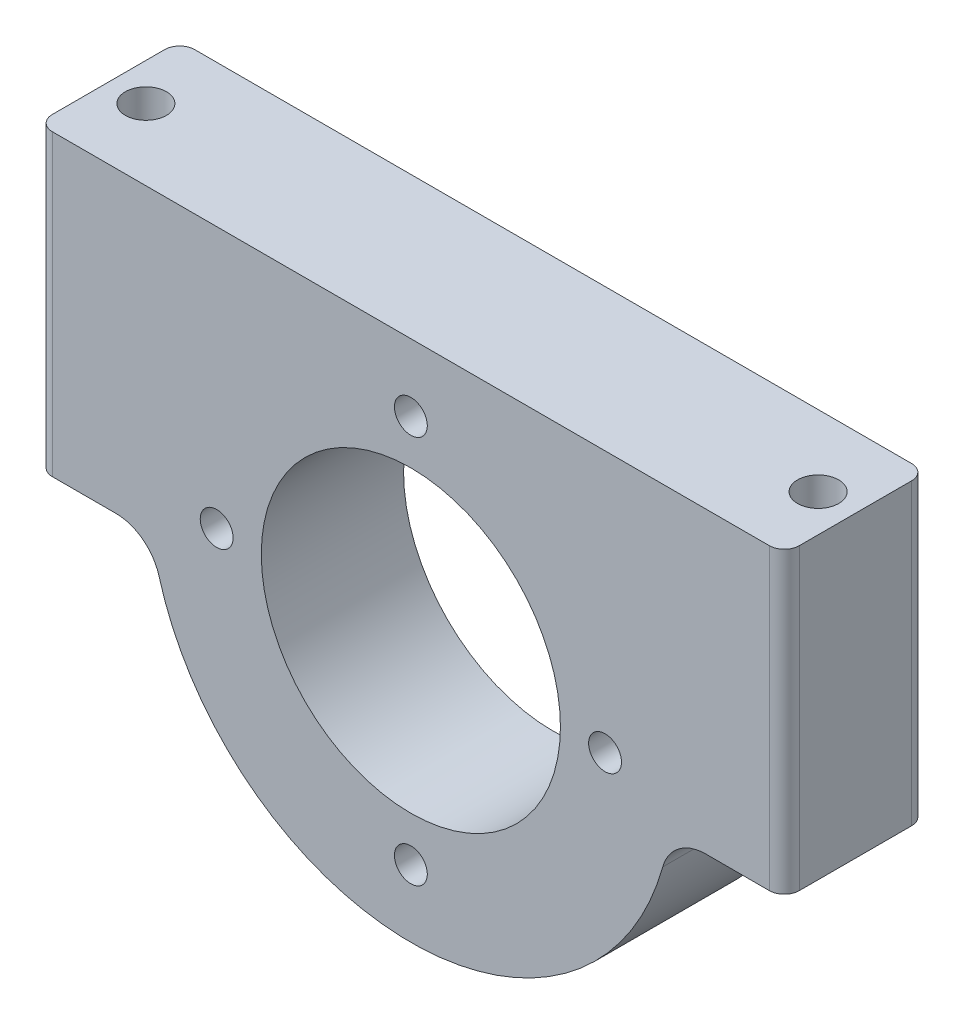
ISO-10303-21;
HEADER;
FILE_DESCRIPTION(('STEP AP214'),'2;1');
FILE_NAME('part.step','',(''),(''),'','','');
FILE_SCHEMA(('AUTOMOTIVE_DESIGN { 1 0 10303 214 1 1 1 1 }'));
ENDSEC;
DATA;
#1=APPLICATION_CONTEXT('core data for automotive mechanical design processes');
#2=APPLICATION_PROTOCOL_DEFINITION('international standard','automotive_design',2000,#1);
#3=PRODUCT_CONTEXT('',#1,'mechanical');
#4=PRODUCT('Part','Part','',(#3));
#5=PRODUCT_RELATED_PRODUCT_CATEGORY('part','',(#4));
#6=PRODUCT_DEFINITION_FORMATION('','',#4);
#7=PRODUCT_DEFINITION_CONTEXT('part definition',#1,'design');
#8=PRODUCT_DEFINITION('design','',#6,#7);
#9=PRODUCT_DEFINITION_SHAPE('','',#8);
#10=(LENGTH_UNIT() NAMED_UNIT(*) SI_UNIT(.MILLI.,.METRE.));
#11=(NAMED_UNIT(*) PLANE_ANGLE_UNIT() SI_UNIT($,.RADIAN.));
#12=(NAMED_UNIT(*) SI_UNIT($,.STERADIAN.) SOLID_ANGLE_UNIT());
#13=UNCERTAINTY_MEASURE_WITH_UNIT(LENGTH_MEASURE(1.E-05),#10,'distance_accuracy_value','');
#14=(GEOMETRIC_REPRESENTATION_CONTEXT(3) GLOBAL_UNCERTAINTY_ASSIGNED_CONTEXT((#13)) GLOBAL_UNIT_ASSIGNED_CONTEXT((#10,
#11,#12)) REPRESENTATION_CONTEXT('',''));
#15=CARTESIAN_POINT('',(0.,0.,0.));
#16=DIRECTION('',(0.,0.,1.));
#17=DIRECTION('',(1.,0.,0.));
#18=AXIS2_PLACEMENT_3D('',#15,#16,#17);
#19=CARTESIAN_POINT('',(463.810652388512,-202.071051768843,-19.05));
#20=DIRECTION('',(0.,0.,-1.));
#21=DIRECTION('',(-1.,0.,0.));
#22=AXIS2_PLACEMENT_3D('',#19,#20,#21);
#23=CYLINDRICAL_SURFACE('',#22,4.125);
#24=CARTESIAN_POINT('',(463.810652388512,-202.071051768843,-19.05));
#25=DIRECTION('',(0.,0.,-1.));
#26=DIRECTION('',(-1.,0.,0.));
#27=AXIS2_PLACEMENT_3D('',#24,#25,#26);
#28=CIRCLE('',#27,4.125);
#29=CARTESIAN_POINT('',(459.685652388512,-202.071051768843,-19.05));
#30=VERTEX_POINT('',#29);
#31=EDGE_CURVE('E160',#30,#30,#28,.F.);
#32=ORIENTED_EDGE('',*,*,#31,.F.);
#33=EDGE_LOOP('',(#32));
#34=FACE_BOUND('',#33,.T.);
#35=CARTESIAN_POINT('',(463.810652388512,-202.071051768843,-15.05));
#36=DIRECTION('',(0.,0.,-1.));
#37=DIRECTION('',(-1.,0.,0.));
#38=AXIS2_PLACEMENT_3D('',#35,#36,#37);
#39=CIRCLE('',#38,4.125);
#40=CARTESIAN_POINT('',(459.685652388512,-202.071051768843,-15.05));
#41=VERTEX_POINT('',#40);
#42=EDGE_CURVE('E20',#41,#41,#39,.T.);
#43=ORIENTED_EDGE('',*,*,#42,.F.);
#44=EDGE_LOOP('',(#43));
#45=FACE_BOUND('',#44,.T.);
#46=ADVANCED_FACE('F17',(#34,#45),#23,.F.);
#47=CARTESIAN_POINT('',(463.810652388512,-254.071051768843,-19.05));
#48=DIRECTION('',(0.,0.,-1.));
#49=DIRECTION('',(-1.,0.,0.));
#50=AXIS2_PLACEMENT_3D('',#47,#48,#49);
#51=CYLINDRICAL_SURFACE('',#50,4.125);
#52=CARTESIAN_POINT('',(463.810652388512,-254.071051768843,-19.05));
#53=DIRECTION('',(0.,0.,-1.));
#54=DIRECTION('',(-1.,0.,0.));
#55=AXIS2_PLACEMENT_3D('',#52,#53,#54);
#56=CIRCLE('',#55,4.125);
#57=CARTESIAN_POINT('',(459.685652388512,-254.071051768843,-19.05));
#58=VERTEX_POINT('',#57);
#59=EDGE_CURVE('E271',#58,#58,#56,.F.);
#60=ORIENTED_EDGE('',*,*,#59,.F.);
#61=EDGE_LOOP('',(#60));
#62=FACE_BOUND('',#61,.T.);
#63=CARTESIAN_POINT('',(463.810652388512,-254.071051768843,-15.05));
#64=DIRECTION('',(0.,0.,-1.));
#65=DIRECTION('',(-1.,0.,0.));
#66=AXIS2_PLACEMENT_3D('',#63,#64,#65);
#67=CIRCLE('',#66,4.125);
#68=CARTESIAN_POINT('',(459.685652388512,-254.071051768843,-15.05));
#69=VERTEX_POINT('',#68);
#70=EDGE_CURVE('E284',#69,#69,#67,.T.);
#71=ORIENTED_EDGE('',*,*,#70,.F.);
#72=EDGE_LOOP('',(#71));
#73=FACE_BOUND('',#72,.T.);
#74=ADVANCED_FACE('F297',(#62,#73),#51,.F.);
#75=CARTESIAN_POINT('',(489.810652388512,-228.071051768843,-19.05));
#76=DIRECTION('',(0.,0.,-1.));
#77=DIRECTION('',(-1.,0.,0.));
#78=AXIS2_PLACEMENT_3D('',#75,#76,#77);
#79=CYLINDRICAL_SURFACE('',#78,4.125);
#80=CARTESIAN_POINT('',(489.810652388512,-228.071051768843,-19.05));
#81=DIRECTION('',(0.,0.,-1.));
#82=DIRECTION('',(-1.,0.,0.));
#83=AXIS2_PLACEMENT_3D('',#80,#81,#82);
#84=CIRCLE('',#83,4.125);
#85=CARTESIAN_POINT('',(485.685652388512,-228.071051768843,-19.05));
#86=VERTEX_POINT('',#85);
#87=EDGE_CURVE('E267',#86,#86,#84,.F.);
#88=ORIENTED_EDGE('',*,*,#87,.F.);
#89=EDGE_LOOP('',(#88));
#90=FACE_BOUND('',#89,.T.);
#91=CARTESIAN_POINT('',(489.810652388512,-228.071051768843,-15.05));
#92=DIRECTION('',(0.,0.,-1.));
#93=DIRECTION('',(-1.,0.,0.));
#94=AXIS2_PLACEMENT_3D('',#91,#92,#93);
#95=CIRCLE('',#94,4.125);
#96=CARTESIAN_POINT('',(485.685652388512,-228.071051768843,-15.05));
#97=VERTEX_POINT('',#96);
#98=EDGE_CURVE('E281',#97,#97,#95,.T.);
#99=ORIENTED_EDGE('',*,*,#98,.F.);
#100=EDGE_LOOP('',(#99));
#101=FACE_BOUND('',#100,.T.);
#102=ADVANCED_FACE('F302',(#90,#101),#79,.F.);
#103=CARTESIAN_POINT('',(437.810652388512,-228.071051768843,-19.05));
#104=DIRECTION('',(0.,0.,-1.));
#105=DIRECTION('',(-1.,0.,0.));
#106=AXIS2_PLACEMENT_3D('',#103,#104,#105);
#107=CYLINDRICAL_SURFACE('',#106,4.125);
#108=CARTESIAN_POINT('',(437.810652388512,-228.071051768843,-19.05));
#109=DIRECTION('',(0.,0.,-1.));
#110=DIRECTION('',(-1.,0.,0.));
#111=AXIS2_PLACEMENT_3D('',#108,#109,#110);
#112=CIRCLE('',#111,4.125);
#113=CARTESIAN_POINT('',(433.685652388512,-228.071051768843,-19.05));
#114=VERTEX_POINT('',#113);
#115=EDGE_CURVE('E125',#114,#114,#112,.F.);
#116=ORIENTED_EDGE('',*,*,#115,.F.);
#117=EDGE_LOOP('',(#116));
#118=FACE_BOUND('',#117,.T.);
#119=CARTESIAN_POINT('',(437.810652388512,-228.071051768843,-15.05));
#120=DIRECTION('',(0.,0.,-1.));
#121=DIRECTION('',(-1.,0.,0.));
#122=AXIS2_PLACEMENT_3D('',#119,#120,#121);
#123=CIRCLE('',#122,4.125);
#124=CARTESIAN_POINT('',(433.685652388512,-228.071051768843,-15.05));
#125=VERTEX_POINT('',#124);
#126=EDGE_CURVE('E161',#125,#125,#123,.T.);
#127=ORIENTED_EDGE('',*,*,#126,.F.);
#128=EDGE_LOOP('',(#127));
#129=FACE_BOUND('',#128,.T.);
#130=ADVANCED_FACE('F399',(#118,#129),#107,.F.);
#131=CARTESIAN_POINT('',(5.,0.78094512195122,-15.05));
#132=DIRECTION('',(0.,0.,-1.));
#133=DIRECTION('',(-1.,0.,0.));
#134=AXIS2_PLACEMENT_3D('',#131,#132,#133);
#135=PLANE('',#134);
#136=CARTESIAN_POINT('',(463.810652388512,-202.071051768843,-15.05));
#137=DIRECTION('',(0.,0.,-1.));
#138=DIRECTION('',(-1.,0.,0.));
#139=AXIS2_PLACEMENT_3D('',#136,#137,#138);
#140=CIRCLE('',#139,2.2);
#141=CARTESIAN_POINT('',(461.610652388512,-202.071051768843,-15.05));
#142=VERTEX_POINT('',#141);
#143=EDGE_CURVE('E154',#142,#142,#140,.F.);
#144=ORIENTED_EDGE('',*,*,#143,.T.);
#145=EDGE_LOOP('',(#144));
#146=FACE_BOUND('',#145,.T.);
#147=ORIENTED_EDGE('',*,*,#42,.T.);
#148=EDGE_LOOP('',(#147));
#149=FACE_BOUND('',#148,.T.);
#150=ADVANCED_FACE('F294',(#146,#149),#135,.T.);
#151=CARTESIAN_POINT('',(5.,0.78094512195122,-15.05));
#152=DIRECTION('',(0.,0.,-1.));
#153=DIRECTION('',(-1.,0.,0.));
#154=AXIS2_PLACEMENT_3D('',#151,#152,#153);
#155=PLANE('',#154);
#156=CARTESIAN_POINT('',(463.810652388512,-254.071051768843,-15.05));
#157=DIRECTION('',(0.,0.,-1.));
#158=DIRECTION('',(-1.,0.,0.));
#159=AXIS2_PLACEMENT_3D('',#156,#157,#158);
#160=CIRCLE('',#159,2.2);
#161=CARTESIAN_POINT('',(461.610652388512,-254.071051768843,-15.05));
#162=VERTEX_POINT('',#161);
#163=EDGE_CURVE('E257',#162,#162,#160,.F.);
#164=ORIENTED_EDGE('',*,*,#163,.T.);
#165=EDGE_LOOP('',(#164));
#166=FACE_BOUND('',#165,.T.);
#167=ORIENTED_EDGE('',*,*,#70,.T.);
#168=EDGE_LOOP('',(#167));
#169=FACE_BOUND('',#168,.T.);
#170=ADVANCED_FACE('F392',(#166,#169),#155,.T.);
#171=CARTESIAN_POINT('',(5.,0.78094512195122,-15.05));
#172=DIRECTION('',(0.,0.,-1.));
#173=DIRECTION('',(-1.,0.,0.));
#174=AXIS2_PLACEMENT_3D('',#171,#172,#173);
#175=PLANE('',#174);
#176=CARTESIAN_POINT('',(489.810652388512,-228.071051768843,-15.05));
#177=DIRECTION('',(0.,0.,-1.));
#178=DIRECTION('',(-1.,0.,0.));
#179=AXIS2_PLACEMENT_3D('',#176,#177,#178);
#180=CIRCLE('',#179,2.2);
#181=CARTESIAN_POINT('',(487.610652388512,-228.071051768843,-15.05));
#182=VERTEX_POINT('',#181);
#183=EDGE_CURVE('E249',#182,#182,#180,.F.);
#184=ORIENTED_EDGE('',*,*,#183,.T.);
#185=EDGE_LOOP('',(#184));
#186=FACE_BOUND('',#185,.T.);
#187=ORIENTED_EDGE('',*,*,#98,.T.);
#188=EDGE_LOOP('',(#187));
#189=FACE_BOUND('',#188,.T.);
#190=ADVANCED_FACE('F388',(#186,#189),#175,.T.);
#191=CARTESIAN_POINT('',(5.,0.78094512195122,-15.05));
#192=DIRECTION('',(0.,0.,-1.));
#193=DIRECTION('',(-1.,0.,0.));
#194=AXIS2_PLACEMENT_3D('',#191,#192,#193);
#195=PLANE('',#194);
#196=CARTESIAN_POINT('',(437.810652388512,-228.071051768843,-15.05));
#197=DIRECTION('',(0.,0.,-1.));
#198=DIRECTION('',(-1.,0.,0.));
#199=AXIS2_PLACEMENT_3D('',#196,#197,#198);
#200=CIRCLE('',#199,2.2);
#201=CARTESIAN_POINT('',(435.610652388512,-228.071051768843,-15.05));
#202=VERTEX_POINT('',#201);
#203=EDGE_CURVE('E245',#202,#202,#200,.F.);
#204=ORIENTED_EDGE('',*,*,#203,.T.);
#205=EDGE_LOOP('',(#204));
#206=FACE_BOUND('',#205,.T.);
#207=ORIENTED_EDGE('',*,*,#126,.T.);
#208=EDGE_LOOP('',(#207));
#209=FACE_BOUND('',#208,.T.);
#210=ADVANCED_FACE('F384',(#206,#209),#195,.T.);
#211=CARTESIAN_POINT('',(508.810652388512,-186.071049368843,-9.52500000000001));
#212=DIRECTION('',(0.,-1.,0.));
#213=DIRECTION('',(0.,0.,-1.));
#214=AXIS2_PLACEMENT_3D('',#211,#212,#213);
#215=CYLINDRICAL_SURFACE('',#214,2.75);
#216=CARTESIAN_POINT('',(508.810652388512,-233.071051768843,-9.52500000000001));
#217=DIRECTION('',(0.,-1.,0.));
#218=DIRECTION('',(0.,0.,-1.));
#219=AXIS2_PLACEMENT_3D('',#216,#217,#218);
#220=CIRCLE('',#219,2.75);
#221=CARTESIAN_POINT('',(508.810652388512,-233.071051768843,-12.275));
#222=VERTEX_POINT('',#221);
#223=EDGE_CURVE('E232',#222,#222,#220,.F.);
#224=ORIENTED_EDGE('',*,*,#223,.F.);
#225=EDGE_LOOP('',(#224));
#226=FACE_BOUND('',#225,.T.);
#227=CARTESIAN_POINT('',(508.810652388512,-193.071051768843,-9.52500000000001));
#228=DIRECTION('',(0.,-1.,0.));
#229=DIRECTION('',(0.,0.,-1.));
#230=AXIS2_PLACEMENT_3D('',#227,#228,#229);
#231=CIRCLE('',#230,2.75);
#232=CARTESIAN_POINT('',(508.810652388512,-193.071051768843,-12.275));
#233=VERTEX_POINT('',#232);
#234=EDGE_CURVE('E241',#233,#233,#231,.T.);
#235=ORIENTED_EDGE('',*,*,#234,.F.);
#236=EDGE_LOOP('',(#235));
#237=FACE_BOUND('',#236,.T.);
#238=ADVANCED_FACE('F381',(#226,#237),#215,.F.);
#239=CARTESIAN_POINT('',(511.810652388512,0.78094512195122,-17.05));
#240=DIRECTION('',(0.,-1.,0.));
#241=DIRECTION('',(0.,0.,-1.));
#242=AXIS2_PLACEMENT_3D('',#239,#240,#241);
#243=CYLINDRICAL_SURFACE('',#242,2.);
#244=DIRECTION('',(0.,1.,0.));
#245=VECTOR('',#244,1.);
#246=CARTESIAN_POINT('',(513.810652388512,-263.071051768843,-17.05));
#247=LINE('',#246,#245);
#248=CARTESIAN_POINT('',(513.810652388512,-233.071051768843,-17.05));
#249=VERTEX_POINT('',#248);
#250=CARTESIAN_POINT('',(513.810652388512,-193.071051768843,-17.05));
#251=VERTEX_POINT('',#250);
#252=EDGE_CURVE('E98',#249,#251,#247,.T.);
#253=ORIENTED_EDGE('',*,*,#252,.F.);
#254=CARTESIAN_POINT('',(511.810652388512,-233.071051768843,-17.05));
#255=DIRECTION('',(0.,-1.,0.));
#256=DIRECTION('',(0.,0.,-1.));
#257=AXIS2_PLACEMENT_3D('',#254,#255,#256);
#258=CIRCLE('',#257,2.);
#259=CARTESIAN_POINT('',(511.810652388512,-233.071051768843,-19.05));
#260=VERTEX_POINT('',#259);
#261=EDGE_CURVE('E119',#260,#249,#258,.T.);
#262=ORIENTED_EDGE('',*,*,#261,.F.);
#263=DIRECTION('',(0.,1.,0.));
#264=VECTOR('',#263,1.);
#265=CARTESIAN_POINT('',(511.810652388512,0.78094512195122,-19.05));
#266=LINE('',#265,#264);
#267=CARTESIAN_POINT('',(511.810652388512,-193.071051768843,-19.05));
#268=VERTEX_POINT('',#267);
#269=EDGE_CURVE('E117',#268,#260,#266,.F.);
#270=ORIENTED_EDGE('',*,*,#269,.F.);
#271=CARTESIAN_POINT('',(511.810652388512,-193.071051768843,-17.05));
#272=DIRECTION('',(0.,-1.,0.));
#273=DIRECTION('',(0.,0.,-1.));
#274=AXIS2_PLACEMENT_3D('',#271,#272,#273);
#275=CIRCLE('',#274,2.);
#276=EDGE_CURVE('E104',#251,#268,#275,.F.);
#277=ORIENTED_EDGE('',*,*,#276,.F.);
#278=EDGE_LOOP('',(#253,#262,#270,#277));
#279=FACE_BOUND('',#278,.T.);
#280=ADVANCED_FACE('F118',(#279),#243,.T.);
#281=CARTESIAN_POINT('',(513.810652388512,-263.071051768843,0.));
#282=DIRECTION('',(1.,0.,0.));
#283=DIRECTION('',(0.,0.,-1.));
#284=AXIS2_PLACEMENT_3D('',#281,#282,#283);
#285=PLANE('',#284);
#286=ORIENTED_EDGE('',*,*,#252,.T.);
#287=DIRECTION('',(0.,0.,1.));
#288=VECTOR('',#287,1.);
#289=CARTESIAN_POINT('',(513.810652388512,-193.071051768843,0.));
#290=LINE('',#289,#288);
#291=CARTESIAN_POINT('',(513.810652388512,-193.071051768843,-2.));
#292=VERTEX_POINT('',#291);
#293=EDGE_CURVE('E112',#292,#251,#290,.F.);
#294=ORIENTED_EDGE('',*,*,#293,.F.);
#295=DIRECTION('',(0.,-1.,0.));
#296=VECTOR('',#295,1.);
#297=CARTESIAN_POINT('',(513.810652388512,0.78094512195122,-2.));
#298=LINE('',#297,#296);
#299=CARTESIAN_POINT('',(513.810652388512,-233.071051768843,-2.));
#300=VERTEX_POINT('',#299);
#301=EDGE_CURVE('E155',#300,#292,#298,.F.);
#302=ORIENTED_EDGE('',*,*,#301,.F.);
#303=DIRECTION('',(0.,0.,-1.));
#304=VECTOR('',#303,1.);
#305=CARTESIAN_POINT('',(513.810652388512,-233.071051768843,-9.52499999999998));
#306=LINE('',#305,#304);
#307=EDGE_CURVE('E228',#249,#300,#306,.F.);
#308=ORIENTED_EDGE('',*,*,#307,.F.);
#309=EDGE_LOOP('',(#286,#294,#302,#308));
#310=FACE_BOUND('',#309,.T.);
#311=ADVANCED_FACE('F375',(#310),#285,.T.);
#312=CARTESIAN_POINT('',(418.810652388512,-186.071049368843,-9.52500000000001));
#313=DIRECTION('',(0.,-1.,0.));
#314=DIRECTION('',(0.,0.,-1.));
#315=AXIS2_PLACEMENT_3D('',#312,#313,#314);
#316=CYLINDRICAL_SURFACE('',#315,2.75);
#317=CARTESIAN_POINT('',(418.810652388512,-233.071051768843,-9.52500000000001));
#318=DIRECTION('',(0.,-1.,0.));
#319=DIRECTION('',(0.,0.,-1.));
#320=AXIS2_PLACEMENT_3D('',#317,#318,#319);
#321=CIRCLE('',#320,2.75);
#322=CARTESIAN_POINT('',(418.810652388512,-233.071051768843,-12.275));
#323=VERTEX_POINT('',#322);
#324=EDGE_CURVE('E207',#323,#323,#321,.F.);
#325=ORIENTED_EDGE('',*,*,#324,.F.);
#326=EDGE_LOOP('',(#325));
#327=FACE_BOUND('',#326,.T.);
#328=CARTESIAN_POINT('',(418.810652388512,-193.071051768843,-9.52500000000001));
#329=DIRECTION('',(0.,-1.,0.));
#330=DIRECTION('',(0.,0.,-1.));
#331=AXIS2_PLACEMENT_3D('',#328,#329,#330);
#332=CIRCLE('',#331,2.75);
#333=CARTESIAN_POINT('',(418.810652388512,-193.071051768843,-12.275));
#334=VERTEX_POINT('',#333);
#335=EDGE_CURVE('E145',#334,#334,#332,.T.);
#336=ORIENTED_EDGE('',*,*,#335,.F.);
#337=EDGE_LOOP('',(#336));
#338=FACE_BOUND('',#337,.T.);
#339=ADVANCED_FACE('F371',(#327,#338),#316,.F.);
#340=CARTESIAN_POINT('',(415.810652388512,0.78094512195122,-17.05));
#341=DIRECTION('',(0.,1.,0.));
#342=DIRECTION('',(0.,0.,1.));
#343=AXIS2_PLACEMENT_3D('',#340,#341,#342);
#344=CYLINDRICAL_SURFACE('',#343,2.);
#345=DIRECTION('',(0.,1.,0.));
#346=VECTOR('',#345,1.);
#347=CARTESIAN_POINT('',(413.810652388512,-193.071051768843,-17.05));
#348=LINE('',#347,#346);
#349=CARTESIAN_POINT('',(413.810652388512,-193.071051768843,-17.05));
#350=VERTEX_POINT('',#349);
#351=CARTESIAN_POINT('',(413.810652388512,-233.071051768843,-17.05));
#352=VERTEX_POINT('',#351);
#353=EDGE_CURVE('E151',#350,#352,#348,.F.);
#354=ORIENTED_EDGE('',*,*,#353,.F.);
#355=CARTESIAN_POINT('',(415.810652388512,-193.071051768843,-17.05));
#356=DIRECTION('',(0.,1.,0.));
#357=DIRECTION('',(0.,0.,1.));
#358=AXIS2_PLACEMENT_3D('',#355,#356,#357);
#359=CIRCLE('',#358,2.);
#360=CARTESIAN_POINT('',(415.810652388512,-193.071051768843,-19.05));
#361=VERTEX_POINT('',#360);
#362=EDGE_CURVE('E132',#361,#350,#359,.T.);
#363=ORIENTED_EDGE('',*,*,#362,.F.);
#364=DIRECTION('',(0.,1.,0.));
#365=VECTOR('',#364,1.);
#366=CARTESIAN_POINT('',(415.810652388512,0.78094512195122,-19.05));
#367=LINE('',#366,#365);
#368=CARTESIAN_POINT('',(415.810652388512,-233.071051768843,-19.05));
#369=VERTEX_POINT('',#368);
#370=EDGE_CURVE('E124',#369,#361,#367,.T.);
#371=ORIENTED_EDGE('',*,*,#370,.F.);
#372=CARTESIAN_POINT('',(415.810652388512,-233.071051768843,-17.05));
#373=DIRECTION('',(0.,1.,0.));
#374=DIRECTION('',(0.,0.,1.));
#375=AXIS2_PLACEMENT_3D('',#372,#373,#374);
#376=CIRCLE('',#375,2.);
#377=EDGE_CURVE('E203',#352,#369,#376,.F.);
#378=ORIENTED_EDGE('',*,*,#377,.F.);
#379=EDGE_LOOP('',(#354,#363,#371,#378));
#380=FACE_BOUND('',#379,.T.);
#381=ADVANCED_FACE('F368',(#380),#344,.T.);
#382=CARTESIAN_POINT('',(5.,0.78094512195122,-19.05));
#383=DIRECTION('',(0.,0.,-1.));
#384=DIRECTION('',(-1.,0.,0.));
#385=AXIS2_PLACEMENT_3D('',#382,#383,#384);
#386=PLANE('',#385);
#387=ORIENTED_EDGE('',*,*,#370,.T.);
#388=DIRECTION('',(1.,0.,0.));
#389=VECTOR('',#388,1.);
#390=CARTESIAN_POINT('',(513.810652388512,-193.071051768843,-19.05));
#391=LINE('',#390,#389);
#392=EDGE_CURVE('E109',#268,#361,#391,.F.);
#393=ORIENTED_EDGE('',*,*,#392,.F.);
#394=ORIENTED_EDGE('',*,*,#269,.T.);
#395=DIRECTION('',(1.,0.,0.));
#396=VECTOR('',#395,1.);
#397=CARTESIAN_POINT('',(463.810652388512,-233.071051768843,-19.05));
#398=LINE('',#397,#396);
#399=CARTESIAN_POINT('',(503.307487704775,-233.071051768843,-19.05));
#400=VERTEX_POINT('',#399);
#401=EDGE_CURVE('E231',#400,#260,#398,.T.);
#402=ORIENTED_EDGE('',*,*,#401,.F.);
#403=CARTESIAN_POINT('',(503.307487704775,-239.071051768843,-19.05));
#404=DIRECTION('',(0.,0.,-1.));
#405=DIRECTION('',(-1.,0.,0.));
#406=AXIS2_PLACEMENT_3D('',#403,#404,#405);
#407=CIRCLE('',#406,6.);
#408=CARTESIAN_POINT('',(497.527463024346,-237.461295671282,-19.05));
#409=VERTEX_POINT('',#408);
#410=EDGE_CURVE('E221',#400,#409,#407,.F.);
#411=ORIENTED_EDGE('',*,*,#410,.T.);
#412=CARTESIAN_POINT('',(463.810652388512,-228.071051768843,-19.05));
#413=DIRECTION('',(0.,0.,-1.));
#414=DIRECTION('',(-1.,0.,0.));
#415=AXIS2_PLACEMENT_3D('',#412,#413,#414);
#416=CIRCLE('',#415,35.);
#417=CARTESIAN_POINT('',(430.093841752678,-237.461295671282,-19.05));
#418=VERTEX_POINT('',#417);
#419=EDGE_CURVE('E216',#418,#409,#416,.F.);
#420=ORIENTED_EDGE('',*,*,#419,.F.);
#421=CARTESIAN_POINT('',(424.313817072249,-239.071051768843,-19.05));
#422=DIRECTION('',(0.,0.,-1.));
#423=DIRECTION('',(-1.,0.,0.));
#424=AXIS2_PLACEMENT_3D('',#421,#422,#423);
#425=CIRCLE('',#424,6.);
#426=CARTESIAN_POINT('',(424.313817072249,-233.071051768843,-19.05));
#427=VERTEX_POINT('',#426);
#428=EDGE_CURVE('E212',#418,#427,#425,.F.);
#429=ORIENTED_EDGE('',*,*,#428,.T.);
#430=DIRECTION('',(1.,0.,0.));
#431=VECTOR('',#430,1.);
#432=CARTESIAN_POINT('',(463.810652388512,-233.071051768843,-19.05));
#433=LINE('',#432,#431);
#434=EDGE_CURVE('E202',#369,#427,#433,.T.);
#435=ORIENTED_EDGE('',*,*,#434,.F.);
#436=EDGE_LOOP('',(#387,#393,#394,#402,#411,#420,#429,#435));
#437=FACE_BOUND('',#436,.T.);
#438=ORIENTED_EDGE('',*,*,#115,.T.);
#439=EDGE_LOOP('',(#438));
#440=FACE_BOUND('',#439,.T.);
#441=ORIENTED_EDGE('',*,*,#87,.T.);
#442=EDGE_LOOP('',(#441));
#443=FACE_BOUND('',#442,.T.);
#444=CARTESIAN_POINT('',(463.810652388512,-228.071051768843,-19.05));
#445=DIRECTION('',(0.,0.,-1.));
#446=DIRECTION('',(-1.,0.,0.));
#447=AXIS2_PLACEMENT_3D('',#444,#445,#446);
#448=CIRCLE('',#447,20.025);
#449=CARTESIAN_POINT('',(443.785652388512,-228.071051768843,-19.05));
#450=VERTEX_POINT('',#449);
#451=EDGE_CURVE('E253',#450,#450,#448,.F.);
#452=ORIENTED_EDGE('',*,*,#451,.T.);
#453=EDGE_LOOP('',(#452));
#454=FACE_BOUND('',#453,.T.);
#455=ORIENTED_EDGE('',*,*,#59,.T.);
#456=EDGE_LOOP('',(#455));
#457=FACE_BOUND('',#456,.T.);
#458=ORIENTED_EDGE('',*,*,#31,.T.);
#459=EDGE_LOOP('',(#458));
#460=FACE_BOUND('',#459,.T.);
#461=ADVANCED_FACE('F127',(#437,#440,#443,#454,#457,#460),#386,.T.);
#462=CARTESIAN_POINT('',(413.810652388512,-193.071051768843,0.));
#463=DIRECTION('',(-1.,0.,0.));
#464=DIRECTION('',(0.,0.,1.));
#465=AXIS2_PLACEMENT_3D('',#462,#463,#464);
#466=PLANE('',#465);
#467=DIRECTION('',(0.,0.,1.));
#468=VECTOR('',#467,1.);
#469=CARTESIAN_POINT('',(413.810652388512,-193.071051768843,0.));
#470=LINE('',#469,#468);
#471=CARTESIAN_POINT('',(413.810652388512,-193.071051768843,-2.));
#472=VERTEX_POINT('',#471);
#473=EDGE_CURVE('E138',#350,#472,#470,.T.);
#474=ORIENTED_EDGE('',*,*,#473,.F.);
#475=ORIENTED_EDGE('',*,*,#353,.T.);
#476=DIRECTION('',(0.,0.,-1.));
#477=VECTOR('',#476,1.);
#478=CARTESIAN_POINT('',(413.810652388512,-233.071051768843,-9.52499999999998));
#479=LINE('',#478,#477);
#480=CARTESIAN_POINT('',(413.810652388512,-233.071051768843,-2.));
#481=VERTEX_POINT('',#480);
#482=EDGE_CURVE('E206',#481,#352,#479,.T.);
#483=ORIENTED_EDGE('',*,*,#482,.F.);
#484=DIRECTION('',(0.,1.,0.));
#485=VECTOR('',#484,1.);
#486=CARTESIAN_POINT('',(413.810652388512,0.78094512195122,-2.));
#487=LINE('',#486,#485);
#488=EDGE_CURVE('E146',#472,#481,#487,.F.);
#489=ORIENTED_EDGE('',*,*,#488,.F.);
#490=EDGE_LOOP('',(#474,#475,#483,#489));
#491=FACE_BOUND('',#490,.T.);
#492=ADVANCED_FACE('F361',(#491),#466,.T.);
#493=CARTESIAN_POINT('',(463.810652388512,-202.071051768843,0.));
#494=DIRECTION('',(0.,0.,-1.));
#495=DIRECTION('',(-1.,0.,0.));
#496=AXIS2_PLACEMENT_3D('',#493,#494,#495);
#497=CYLINDRICAL_SURFACE('',#496,2.2);
#498=CARTESIAN_POINT('',(463.810652388512,-202.071051768843,0.));
#499=DIRECTION('',(0.,0.,-1.));
#500=DIRECTION('',(-1.,0.,0.));
#501=AXIS2_PLACEMENT_3D('',#498,#499,#500);
#502=CIRCLE('',#501,2.2);
#503=CARTESIAN_POINT('',(461.610652388512,-202.071051768843,0.));
#504=VERTEX_POINT('',#503);
#505=EDGE_CURVE('E193',#504,#504,#502,.F.);
#506=ORIENTED_EDGE('',*,*,#505,.T.);
#507=EDGE_LOOP('',(#506));
#508=FACE_BOUND('',#507,.T.);
#509=ORIENTED_EDGE('',*,*,#143,.F.);
#510=EDGE_LOOP('',(#509));
#511=FACE_BOUND('',#510,.T.);
#512=ADVANCED_FACE('F357',(#508,#511),#497,.F.);
#513=CARTESIAN_POINT('',(463.810652388512,-254.071051768843,0.));
#514=DIRECTION('',(0.,0.,-1.));
#515=DIRECTION('',(-1.,0.,0.));
#516=AXIS2_PLACEMENT_3D('',#513,#514,#515);
#517=CYLINDRICAL_SURFACE('',#516,2.2);
#518=CARTESIAN_POINT('',(463.810652388512,-254.071051768843,0.));
#519=DIRECTION('',(0.,0.,-1.));
#520=DIRECTION('',(-1.,0.,0.));
#521=AXIS2_PLACEMENT_3D('',#518,#519,#520);
#522=CIRCLE('',#521,2.2);
#523=CARTESIAN_POINT('',(461.610652388512,-254.071051768843,0.));
#524=VERTEX_POINT('',#523);
#525=EDGE_CURVE('E189',#524,#524,#522,.F.);
#526=ORIENTED_EDGE('',*,*,#525,.T.);
#527=EDGE_LOOP('',(#526));
#528=FACE_BOUND('',#527,.T.);
#529=ORIENTED_EDGE('',*,*,#163,.F.);
#530=EDGE_LOOP('',(#529));
#531=FACE_BOUND('',#530,.T.);
#532=ADVANCED_FACE('F353',(#528,#531),#517,.F.);
#533=CARTESIAN_POINT('',(463.810652388512,-228.071051768843,0.));
#534=DIRECTION('',(0.,0.,-1.));
#535=DIRECTION('',(-1.,0.,0.));
#536=AXIS2_PLACEMENT_3D('',#533,#534,#535);
#537=CYLINDRICAL_SURFACE('',#536,20.025);
#538=CARTESIAN_POINT('',(463.810652388512,-228.071051768843,0.));
#539=DIRECTION('',(0.,0.,-1.));
#540=DIRECTION('',(-1.,0.,0.));
#541=AXIS2_PLACEMENT_3D('',#538,#539,#540);
#542=CIRCLE('',#541,20.025);
#543=CARTESIAN_POINT('',(443.785652388512,-228.071051768843,0.));
#544=VERTEX_POINT('',#543);
#545=EDGE_CURVE('E185',#544,#544,#542,.F.);
#546=ORIENTED_EDGE('',*,*,#545,.T.);
#547=EDGE_LOOP('',(#546));
#548=FACE_BOUND('',#547,.T.);
#549=ORIENTED_EDGE('',*,*,#451,.F.);
#550=EDGE_LOOP('',(#549));
#551=FACE_BOUND('',#550,.T.);
#552=ADVANCED_FACE('F349',(#548,#551),#537,.F.);
#553=CARTESIAN_POINT('',(489.810652388512,-228.071051768843,0.));
#554=DIRECTION('',(0.,0.,-1.));
#555=DIRECTION('',(-1.,0.,0.));
#556=AXIS2_PLACEMENT_3D('',#553,#554,#555);
#557=CYLINDRICAL_SURFACE('',#556,2.2);
#558=CARTESIAN_POINT('',(489.810652388512,-228.071051768843,0.));
#559=DIRECTION('',(0.,0.,-1.));
#560=DIRECTION('',(-1.,0.,0.));
#561=AXIS2_PLACEMENT_3D('',#558,#559,#560);
#562=CIRCLE('',#561,2.2);
#563=CARTESIAN_POINT('',(487.610652388512,-228.071051768843,0.));
#564=VERTEX_POINT('',#563);
#565=EDGE_CURVE('E181',#564,#564,#562,.F.);
#566=ORIENTED_EDGE('',*,*,#565,.T.);
#567=EDGE_LOOP('',(#566));
#568=FACE_BOUND('',#567,.T.);
#569=ORIENTED_EDGE('',*,*,#183,.F.);
#570=EDGE_LOOP('',(#569));
#571=FACE_BOUND('',#570,.T.);
#572=ADVANCED_FACE('F345',(#568,#571),#557,.F.);
#573=CARTESIAN_POINT('',(437.810652388512,-228.071051768843,0.));
#574=DIRECTION('',(0.,0.,-1.));
#575=DIRECTION('',(-1.,0.,0.));
#576=AXIS2_PLACEMENT_3D('',#573,#574,#575);
#577=CYLINDRICAL_SURFACE('',#576,2.2);
#578=CARTESIAN_POINT('',(437.810652388512,-228.071051768843,0.));
#579=DIRECTION('',(0.,0.,-1.));
#580=DIRECTION('',(-1.,0.,0.));
#581=AXIS2_PLACEMENT_3D('',#578,#579,#580);
#582=CIRCLE('',#581,2.2);
#583=CARTESIAN_POINT('',(435.610652388512,-228.071051768843,0.));
#584=VERTEX_POINT('',#583);
#585=EDGE_CURVE('E176',#584,#584,#582,.F.);
#586=ORIENTED_EDGE('',*,*,#585,.T.);
#587=EDGE_LOOP('',(#586));
#588=FACE_BOUND('',#587,.T.);
#589=ORIENTED_EDGE('',*,*,#203,.F.);
#590=EDGE_LOOP('',(#589));
#591=FACE_BOUND('',#590,.T.);
#592=ADVANCED_FACE('F342',(#588,#591),#577,.F.);
#593=CARTESIAN_POINT('',(513.810652388512,-193.071051768843,0.));
#594=DIRECTION('',(0.,1.,0.));
#595=DIRECTION('',(0.,0.,1.));
#596=AXIS2_PLACEMENT_3D('',#593,#594,#595);
#597=PLANE('',#596);
#598=ORIENTED_EDGE('',*,*,#473,.T.);
#599=CARTESIAN_POINT('',(415.810652388512,-193.071051768843,-2.));
#600=DIRECTION('',(0.,1.,0.));
#601=DIRECTION('',(0.,0.,1.));
#602=AXIS2_PLACEMENT_3D('',#599,#600,#601);
#603=CIRCLE('',#602,2.);
#604=CARTESIAN_POINT('',(415.810652388512,-193.071051768843,0.));
#605=VERTEX_POINT('',#604);
#606=EDGE_CURVE('E149',#605,#472,#603,.F.);
#607=ORIENTED_EDGE('',*,*,#606,.F.);
#608=DIRECTION('',(-1.,0.,0.));
#609=VECTOR('',#608,1.);
#610=CARTESIAN_POINT('',(5.,-193.071051768843,0.));
#611=LINE('',#610,#609);
#612=CARTESIAN_POINT('',(511.810652388512,-193.071051768843,0.));
#613=VERTEX_POINT('',#612);
#614=EDGE_CURVE('E180',#605,#613,#611,.F.);
#615=ORIENTED_EDGE('',*,*,#614,.T.);
#616=CARTESIAN_POINT('',(511.810652388512,-193.071051768843,-2.));
#617=DIRECTION('',(0.,-1.,0.));
#618=DIRECTION('',(0.,0.,-1.));
#619=AXIS2_PLACEMENT_3D('',#616,#617,#618);
#620=CIRCLE('',#619,2.);
#621=EDGE_CURVE('E158',#292,#613,#620,.T.);
#622=ORIENTED_EDGE('',*,*,#621,.F.);
#623=ORIENTED_EDGE('',*,*,#293,.T.);
#624=ORIENTED_EDGE('',*,*,#276,.T.);
#625=ORIENTED_EDGE('',*,*,#392,.T.);
#626=ORIENTED_EDGE('',*,*,#362,.T.);
#627=EDGE_LOOP('',(#598,#607,#615,#622,#623,#624,#625,#626));
#628=FACE_BOUND('',#627,.T.);
#629=ORIENTED_EDGE('',*,*,#335,.T.);
#630=EDGE_LOOP('',(#629));
#631=FACE_BOUND('',#630,.T.);
#632=ORIENTED_EDGE('',*,*,#234,.T.);
#633=EDGE_LOOP('',(#632));
#634=FACE_BOUND('',#633,.T.);
#635=ADVANCED_FACE('F106',(#628,#631,#634),#597,.T.);
#636=CARTESIAN_POINT('',(511.810652388512,0.78094512195122,-2.));
#637=DIRECTION('',(0.,-1.,0.));
#638=DIRECTION('',(0.,0.,-1.));
#639=AXIS2_PLACEMENT_3D('',#636,#637,#638);
#640=CYLINDRICAL_SURFACE('',#639,2.);
#641=ORIENTED_EDGE('',*,*,#301,.T.);
#642=ORIENTED_EDGE('',*,*,#621,.T.);
#643=DIRECTION('',(0.,1.,0.));
#644=VECTOR('',#643,1.);
#645=CARTESIAN_POINT('',(511.810652388512,0.78094512195122,0.));
#646=LINE('',#645,#644);
#647=CARTESIAN_POINT('',(511.810652388512,-233.071051768843,0.));
#648=VERTEX_POINT('',#647);
#649=EDGE_CURVE('E719',#613,#648,#646,.F.);
#650=ORIENTED_EDGE('',*,*,#649,.T.);
#651=CARTESIAN_POINT('',(511.810652388512,-233.071051768843,-2.));
#652=DIRECTION('',(0.,-1.,0.));
#653=DIRECTION('',(0.,0.,-1.));
#654=AXIS2_PLACEMENT_3D('',#651,#652,#653);
#655=CIRCLE('',#654,2.);
#656=EDGE_CURVE('E225',#300,#648,#655,.T.);
#657=ORIENTED_EDGE('',*,*,#656,.F.);
#658=EDGE_LOOP('',(#641,#642,#650,#657));
#659=FACE_BOUND('',#658,.T.);
#660=ADVANCED_FACE('F335',(#659),#640,.T.);
#661=CARTESIAN_POINT('',(463.810652388512,-233.071051768843,-9.52499999999998));
#662=DIRECTION('',(0.,-1.,0.));
#663=DIRECTION('',(0.,0.,-1.));
#664=AXIS2_PLACEMENT_3D('',#661,#662,#663);
#665=PLANE('',#664);
#666=ORIENTED_EDGE('',*,*,#656,.T.);
#667=DIRECTION('',(-1.,0.,0.));
#668=VECTOR('',#667,1.);
#669=CARTESIAN_POINT('',(5.,-233.071051768843,0.));
#670=LINE('',#669,#668);
#671=CARTESIAN_POINT('',(503.307487704775,-233.071051768843,0.));
#672=VERTEX_POINT('',#671);
#673=EDGE_CURVE('E175',#648,#672,#670,.T.);
#674=ORIENTED_EDGE('',*,*,#673,.T.);
#675=DIRECTION('',(0.,0.,-1.));
#676=VECTOR('',#675,1.);
#677=CARTESIAN_POINT('',(503.307487704775,-233.071051768843,1.9050024));
#678=LINE('',#677,#676);
#679=EDGE_CURVE('E220',#672,#400,#678,.T.);
#680=ORIENTED_EDGE('',*,*,#679,.T.);
#681=ORIENTED_EDGE('',*,*,#401,.T.);
#682=ORIENTED_EDGE('',*,*,#261,.T.);
#683=ORIENTED_EDGE('',*,*,#307,.T.);
#684=EDGE_LOOP('',(#666,#674,#680,#681,#682,#683));
#685=FACE_BOUND('',#684,.T.);
#686=ORIENTED_EDGE('',*,*,#223,.T.);
#687=EDGE_LOOP('',(#686));
#688=FACE_BOUND('',#687,.T.);
#689=ADVANCED_FACE('F331',(#685,#688),#665,.T.);
#690=CARTESIAN_POINT('',(503.307487704775,-239.071051768843,1.9050024));
#691=DIRECTION('',(0.,0.,-1.));
#692=DIRECTION('',(-1.,0.,0.));
#693=AXIS2_PLACEMENT_3D('',#690,#691,#692);
#694=CYLINDRICAL_SURFACE('',#693,6.);
#695=CARTESIAN_POINT('',(503.307487704775,-239.071051768843,0.));
#696=DIRECTION('',(0.,0.,-1.));
#697=DIRECTION('',(-1.,0.,0.));
#698=AXIS2_PLACEMENT_3D('',#695,#696,#697);
#699=CIRCLE('',#698,6.);
#700=CARTESIAN_POINT('',(497.527463024346,-237.461295671282,0.));
#701=VERTEX_POINT('',#700);
#702=EDGE_CURVE('E171',#672,#701,#699,.F.);
#703=ORIENTED_EDGE('',*,*,#702,.T.);
#704=DIRECTION('',(0.,0.,-1.));
#705=VECTOR('',#704,1.);
#706=CARTESIAN_POINT('',(497.527463024346,-237.461295671282,1.9050024));
#707=LINE('',#706,#705);
#708=EDGE_CURVE('E219',#409,#701,#707,.F.);
#709=ORIENTED_EDGE('',*,*,#708,.F.);
#710=ORIENTED_EDGE('',*,*,#410,.F.);
#711=ORIENTED_EDGE('',*,*,#679,.F.);
#712=EDGE_LOOP('',(#703,#709,#710,#711));
#713=FACE_BOUND('',#712,.T.);
#714=ADVANCED_FACE('F327',(#713),#694,.F.);
#715=CARTESIAN_POINT('',(463.810652388512,-228.071051768843,1.9050024));
#716=DIRECTION('',(0.,0.,-1.));
#717=DIRECTION('',(-1.,0.,0.));
#718=AXIS2_PLACEMENT_3D('',#715,#716,#717);
#719=CYLINDRICAL_SURFACE('',#718,35.);
#720=CARTESIAN_POINT('',(463.810652388512,-228.071051768843,0.));
#721=DIRECTION('',(0.,0.,-1.));
#722=DIRECTION('',(-1.,0.,0.));
#723=AXIS2_PLACEMENT_3D('',#720,#721,#722);
#724=CIRCLE('',#723,35.);
#725=CARTESIAN_POINT('',(430.093841752678,-237.461295671282,0.));
#726=VERTEX_POINT('',#725);
#727=EDGE_CURVE('E167',#701,#726,#724,.T.);
#728=ORIENTED_EDGE('',*,*,#727,.T.);
#729=DIRECTION('',(0.,0.,-1.));
#730=VECTOR('',#729,1.);
#731=CARTESIAN_POINT('',(430.093841752678,-237.461295671282,1.9050024));
#732=LINE('',#731,#730);
#733=EDGE_CURVE('E215',#726,#418,#732,.T.);
#734=ORIENTED_EDGE('',*,*,#733,.T.);
#735=ORIENTED_EDGE('',*,*,#419,.T.);
#736=ORIENTED_EDGE('',*,*,#708,.T.);
#737=EDGE_LOOP('',(#728,#734,#735,#736));
#738=FACE_BOUND('',#737,.T.);
#739=ADVANCED_FACE('F323',(#738),#719,.T.);
#740=CARTESIAN_POINT('',(424.313817072249,-239.071051768843,1.9050024));
#741=DIRECTION('',(0.,0.,-1.));
#742=DIRECTION('',(-1.,0.,0.));
#743=AXIS2_PLACEMENT_3D('',#740,#741,#742);
#744=CYLINDRICAL_SURFACE('',#743,6.);
#745=ORIENTED_EDGE('',*,*,#428,.F.);
#746=ORIENTED_EDGE('',*,*,#733,.F.);
#747=CARTESIAN_POINT('',(424.313817072249,-239.071051768843,0.));
#748=DIRECTION('',(0.,0.,-1.));
#749=DIRECTION('',(-1.,0.,0.));
#750=AXIS2_PLACEMENT_3D('',#747,#748,#749);
#751=CIRCLE('',#750,6.);
#752=CARTESIAN_POINT('',(424.313817072249,-233.071051768843,0.));
#753=VERTEX_POINT('',#752);
#754=EDGE_CURVE('E163',#726,#753,#751,.F.);
#755=ORIENTED_EDGE('',*,*,#754,.T.);
#756=DIRECTION('',(0.,0.,-1.));
#757=VECTOR('',#756,1.);
#758=CARTESIAN_POINT('',(424.313817072249,-233.071051768843,-9.52499999999998));
#759=LINE('',#758,#757);
#760=EDGE_CURVE('E211',#427,#753,#759,.F.);
#761=ORIENTED_EDGE('',*,*,#760,.F.);
#762=EDGE_LOOP('',(#745,#746,#755,#761));
#763=FACE_BOUND('',#762,.T.);
#764=ADVANCED_FACE('F319',(#763),#744,.F.);
#765=CARTESIAN_POINT('',(463.810652388512,-233.071051768843,-9.52499999999998));
#766=DIRECTION('',(0.,-1.,0.));
#767=DIRECTION('',(0.,0.,-1.));
#768=AXIS2_PLACEMENT_3D('',#765,#766,#767);
#769=PLANE('',#768);
#770=ORIENTED_EDGE('',*,*,#377,.T.);
#771=ORIENTED_EDGE('',*,*,#434,.T.);
#772=ORIENTED_EDGE('',*,*,#760,.T.);
#773=DIRECTION('',(-1.,0.,0.));
#774=VECTOR('',#773,1.);
#775=CARTESIAN_POINT('',(5.,-233.071051768843,0.));
#776=LINE('',#775,#774);
#777=CARTESIAN_POINT('',(415.810652388512,-233.071051768843,0.));
#778=VERTEX_POINT('',#777);
#779=EDGE_CURVE('E27',#753,#778,#776,.T.);
#780=ORIENTED_EDGE('',*,*,#779,.T.);
#781=CARTESIAN_POINT('',(415.810652388512,-233.071051768843,-2.));
#782=DIRECTION('',(0.,1.,0.));
#783=DIRECTION('',(0.,0.,1.));
#784=AXIS2_PLACEMENT_3D('',#781,#782,#783);
#785=CIRCLE('',#784,2.);
#786=EDGE_CURVE('E35',#481,#778,#785,.T.);
#787=ORIENTED_EDGE('',*,*,#786,.F.);
#788=ORIENTED_EDGE('',*,*,#482,.T.);
#789=EDGE_LOOP('',(#770,#771,#772,#780,#787,#788));
#790=FACE_BOUND('',#789,.T.);
#791=ORIENTED_EDGE('',*,*,#324,.T.);
#792=EDGE_LOOP('',(#791));
#793=FACE_BOUND('',#792,.T.);
#794=ADVANCED_FACE('F312',(#790,#793),#769,.T.);
#795=CARTESIAN_POINT('',(415.810652388512,0.78094512195122,-2.));
#796=DIRECTION('',(0.,1.,0.));
#797=DIRECTION('',(0.,0.,1.));
#798=AXIS2_PLACEMENT_3D('',#795,#796,#797);
#799=CYLINDRICAL_SURFACE('',#798,2.);
#800=ORIENTED_EDGE('',*,*,#488,.T.);
#801=ORIENTED_EDGE('',*,*,#786,.T.);
#802=DIRECTION('',(0.,1.,0.));
#803=VECTOR('',#802,1.);
#804=CARTESIAN_POINT('',(415.810652388512,0.78094512195122,0.));
#805=LINE('',#804,#803);
#806=EDGE_CURVE('E11',#778,#605,#805,.T.);
#807=ORIENTED_EDGE('',*,*,#806,.T.);
#808=ORIENTED_EDGE('',*,*,#606,.T.);
#809=EDGE_LOOP('',(#800,#801,#807,#808));
#810=FACE_BOUND('',#809,.T.);
#811=ADVANCED_FACE('F307',(#810),#799,.T.);
#812=CARTESIAN_POINT('',(5.,0.78094512195122,0.));
#813=DIRECTION('',(0.,0.,-1.));
#814=DIRECTION('',(-1.,0.,0.));
#815=AXIS2_PLACEMENT_3D('',#812,#813,#814);
#816=PLANE('',#815);
#817=ORIENTED_EDGE('',*,*,#779,.F.);
#818=ORIENTED_EDGE('',*,*,#754,.F.);
#819=ORIENTED_EDGE('',*,*,#727,.F.);
#820=ORIENTED_EDGE('',*,*,#702,.F.);
#821=ORIENTED_EDGE('',*,*,#673,.F.);
#822=ORIENTED_EDGE('',*,*,#649,.F.);
#823=ORIENTED_EDGE('',*,*,#614,.F.);
#824=ORIENTED_EDGE('',*,*,#806,.F.);
#825=EDGE_LOOP('',(#817,#818,#819,#820,#821,#822,#823,#824));
#826=FACE_BOUND('',#825,.T.);
#827=ORIENTED_EDGE('',*,*,#585,.F.);
#828=EDGE_LOOP('',(#827));
#829=FACE_BOUND('',#828,.T.);
#830=ORIENTED_EDGE('',*,*,#565,.F.);
#831=EDGE_LOOP('',(#830));
#832=FACE_BOUND('',#831,.T.);
#833=ORIENTED_EDGE('',*,*,#545,.F.);
#834=EDGE_LOOP('',(#833));
#835=FACE_BOUND('',#834,.T.);
#836=ORIENTED_EDGE('',*,*,#525,.F.);
#837=EDGE_LOOP('',(#836));
#838=FACE_BOUND('',#837,.T.);
#839=ORIENTED_EDGE('',*,*,#505,.F.);
#840=EDGE_LOOP('',(#839));
#841=FACE_BOUND('',#840,.T.);
#842=ADVANCED_FACE('F305',(#826,#829,#832,#835,#838,#841),#816,.F.);
#843=CLOSED_SHELL('',(#46,#74,#102,#130,#150,#170,#190,#210,#238,#280,#311,#339,#381,#461,#492,
#512,#532,#552,#572,#592,#635,#660,#689,#714,#739,#764,#794,#811,#842));
#844=MANIFOLD_SOLID_BREP('B1',#843);
#845=ADVANCED_BREP_SHAPE_REPRESENTATION('',(#18,#844),#14);
#846=SHAPE_DEFINITION_REPRESENTATION(#9,#845);
ENDSEC;
END-ISO-10303-21;
